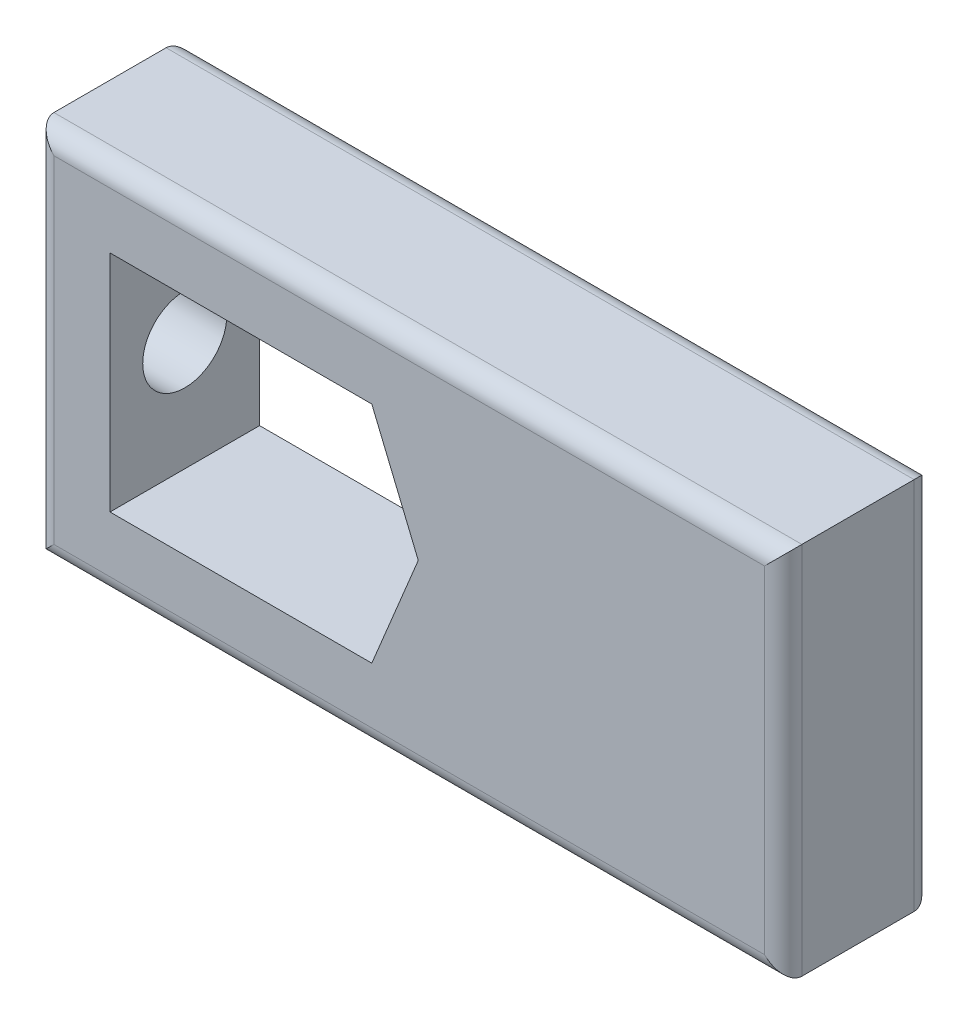
ISO-10303-21;
HEADER;
FILE_DESCRIPTION(('STEP AP214'),'2;1');
FILE_NAME('part.step','',(''),(''),'','','');
FILE_SCHEMA(('AUTOMOTIVE_DESIGN { 1 0 10303 214 1 1 1 1 }'));
ENDSEC;
DATA;
#1=APPLICATION_CONTEXT('core data for automotive mechanical design processes');
#2=APPLICATION_PROTOCOL_DEFINITION('international standard','automotive_design',2000,#1);
#3=PRODUCT_CONTEXT('',#1,'mechanical');
#4=PRODUCT('Part','Part','',(#3));
#5=PRODUCT_RELATED_PRODUCT_CATEGORY('part','',(#4));
#6=PRODUCT_DEFINITION_FORMATION('','',#4);
#7=PRODUCT_DEFINITION_CONTEXT('part definition',#1,'design');
#8=PRODUCT_DEFINITION('design','',#6,#7);
#9=PRODUCT_DEFINITION_SHAPE('','',#8);
#10=(LENGTH_UNIT() NAMED_UNIT(*) SI_UNIT(.MILLI.,.METRE.));
#11=(NAMED_UNIT(*) PLANE_ANGLE_UNIT() SI_UNIT($,.RADIAN.));
#12=(NAMED_UNIT(*) SI_UNIT($,.STERADIAN.) SOLID_ANGLE_UNIT());
#13=UNCERTAINTY_MEASURE_WITH_UNIT(LENGTH_MEASURE(1.E-05),#10,'distance_accuracy_value','');
#14=(GEOMETRIC_REPRESENTATION_CONTEXT(3) GLOBAL_UNCERTAINTY_ASSIGNED_CONTEXT((#13)) GLOBAL_UNIT_ASSIGNED_CONTEXT((#10,
#11,#12)) REPRESENTATION_CONTEXT('',''));
#15=CARTESIAN_POINT('',(0.,0.,0.));
#16=DIRECTION('',(0.,0.,1.));
#17=DIRECTION('',(1.,0.,0.));
#18=AXIS2_PLACEMENT_3D('',#15,#16,#17);
#19=CARTESIAN_POINT('',(0.,0.,8.));
#20=DIRECTION('',(0.,0.,-1.));
#21=DIRECTION('',(-1.,0.,0.));
#22=AXIS2_PLACEMENT_3D('',#19,#20,#21);
#23=PLANE('',#22);
#24=DIRECTION('',(1.,0.,0.));
#25=VECTOR('',#24,1.);
#26=CARTESIAN_POINT('',(0.,1.,8.));
#27=LINE('',#26,#25);
#28=CARTESIAN_POINT('',(1.,1.,8.));
#29=VERTEX_POINT('',#28);
#30=CARTESIAN_POINT('',(39.,1.,8.));
#31=VERTEX_POINT('',#30);
#32=EDGE_CURVE('E226',#29,#31,#27,.T.);
#33=ORIENTED_EDGE('',*,*,#32,.T.);
#34=DIRECTION('',(0.,1.,0.));
#35=VECTOR('',#34,1.);
#36=CARTESIAN_POINT('',(39.,0.,8.));
#37=LINE('',#36,#35);
#38=CARTESIAN_POINT('',(39.,19.,8.));
#39=VERTEX_POINT('',#38);
#40=EDGE_CURVE('E229',#31,#39,#37,.T.);
#41=ORIENTED_EDGE('',*,*,#40,.T.);
#42=DIRECTION('',(-1.,0.,0.));
#43=VECTOR('',#42,1.);
#44=CARTESIAN_POINT('',(0.,19.,8.));
#45=LINE('',#44,#43);
#46=CARTESIAN_POINT('',(1.,19.,8.));
#47=VERTEX_POINT('',#46);
#48=EDGE_CURVE('E216',#39,#47,#45,.T.);
#49=ORIENTED_EDGE('',*,*,#48,.T.);
#50=DIRECTION('',(0.,-1.,0.));
#51=VECTOR('',#50,1.);
#52=CARTESIAN_POINT('',(1.,0.,8.));
#53=LINE('',#52,#51);
#54=EDGE_CURVE('E223',#47,#29,#53,.T.);
#55=ORIENTED_EDGE('',*,*,#54,.T.);
#56=EDGE_LOOP('',(#33,#41,#49,#55));
#57=FACE_BOUND('',#56,.T.);
#58=DIRECTION('',(-1.,0.,0.));
#59=VECTOR('',#58,1.);
#60=CARTESIAN_POINT('',(18.,16.,8.));
#61=LINE('',#60,#59);
#62=CARTESIAN_POINT('',(18.,16.,8.));
#63=VERTEX_POINT('',#62);
#64=CARTESIAN_POINT('',(4.,16.,8.));
#65=VERTEX_POINT('',#64);
#66=EDGE_CURVE('E138',#63,#65,#61,.T.);
#67=ORIENTED_EDGE('',*,*,#66,.F.);
#68=DIRECTION('',(-0.382683432365091,0.923879532511287,0.));
#69=VECTOR('',#68,1.);
#70=CARTESIAN_POINT('',(20.4852813742386,10.,8.));
#71=LINE('',#70,#69);
#72=CARTESIAN_POINT('',(20.4852813742386,10.,8.));
#73=VERTEX_POINT('',#72);
#74=EDGE_CURVE('E174',#73,#63,#71,.T.);
#75=ORIENTED_EDGE('',*,*,#74,.F.);
#76=DIRECTION('',(0.382683432365091,0.923879532511287,0.));
#77=VECTOR('',#76,1.);
#78=CARTESIAN_POINT('',(18.,4.,8.));
#79=LINE('',#78,#77);
#80=CARTESIAN_POINT('',(18.,4.,8.));
#81=VERTEX_POINT('',#80);
#82=EDGE_CURVE('E167',#81,#73,#79,.T.);
#83=ORIENTED_EDGE('',*,*,#82,.F.);
#84=DIRECTION('',(1.,0.,0.));
#85=VECTOR('',#84,1.);
#86=CARTESIAN_POINT('',(4.,4.,8.));
#87=LINE('',#86,#85);
#88=CARTESIAN_POINT('',(4.,4.,8.));
#89=VERTEX_POINT('',#88);
#90=EDGE_CURVE('E163',#89,#81,#87,.T.);
#91=ORIENTED_EDGE('',*,*,#90,.F.);
#92=DIRECTION('',(0.,-1.,0.));
#93=VECTOR('',#92,1.);
#94=CARTESIAN_POINT('',(4.,16.,8.));
#95=LINE('',#94,#93);
#96=EDGE_CURVE('E149',#65,#89,#95,.T.);
#97=ORIENTED_EDGE('',*,*,#96,.F.);
#98=EDGE_LOOP('',(#67,#75,#83,#91,#97));
#99=FACE_BOUND('',#98,.T.);
#100=ADVANCED_FACE('F39',(#57,#99),#23,.F.);
#101=CARTESIAN_POINT('',(0.,0.,0.));
#102=DIRECTION('',(0.,0.,-1.));
#103=DIRECTION('',(-1.,0.,0.));
#104=AXIS2_PLACEMENT_3D('',#101,#102,#103);
#105=PLANE('',#104);
#106=DIRECTION('',(-1.,0.,0.));
#107=VECTOR('',#106,1.);
#108=CARTESIAN_POINT('',(40.,19.,0.));
#109=LINE('',#108,#107);
#110=CARTESIAN_POINT('',(1.,19.,0.));
#111=VERTEX_POINT('',#110);
#112=CARTESIAN_POINT('',(39.,19.,0.));
#113=VERTEX_POINT('',#112);
#114=EDGE_CURVE('E264',#111,#113,#109,.F.);
#115=ORIENTED_EDGE('',*,*,#114,.T.);
#116=DIRECTION('',(0.,1.,0.));
#117=VECTOR('',#116,1.);
#118=CARTESIAN_POINT('',(39.,0.,0.));
#119=LINE('',#118,#117);
#120=CARTESIAN_POINT('',(39.,1.,0.));
#121=VERTEX_POINT('',#120);
#122=EDGE_CURVE('E273',#113,#121,#119,.F.);
#123=ORIENTED_EDGE('',*,*,#122,.T.);
#124=DIRECTION('',(1.,0.,0.));
#125=VECTOR('',#124,1.);
#126=CARTESIAN_POINT('',(0.,1.,0.));
#127=LINE('',#126,#125);
#128=CARTESIAN_POINT('',(1.,1.,0.));
#129=VERTEX_POINT('',#128);
#130=EDGE_CURVE('E270',#121,#129,#127,.F.);
#131=ORIENTED_EDGE('',*,*,#130,.T.);
#132=DIRECTION('',(0.,-1.,0.));
#133=VECTOR('',#132,1.);
#134=CARTESIAN_POINT('',(1.,20.,0.));
#135=LINE('',#134,#133);
#136=EDGE_CURVE('E267',#129,#111,#135,.F.);
#137=ORIENTED_EDGE('',*,*,#136,.T.);
#138=EDGE_LOOP('',(#115,#123,#131,#137));
#139=FACE_BOUND('',#138,.T.);
#140=DIRECTION('',(-0.382683432365091,0.923879532511287,0.));
#141=VECTOR('',#140,1.);
#142=CARTESIAN_POINT('',(20.4852813742386,10.,0.));
#143=LINE('',#142,#141);
#144=CARTESIAN_POINT('',(20.4852813742386,10.,0.));
#145=VERTEX_POINT('',#144);
#146=CARTESIAN_POINT('',(18.,16.,0.));
#147=VERTEX_POINT('',#146);
#148=EDGE_CURVE('E150',#145,#147,#143,.T.);
#149=ORIENTED_EDGE('',*,*,#148,.T.);
#150=DIRECTION('',(-1.,0.,0.));
#151=VECTOR('',#150,1.);
#152=CARTESIAN_POINT('',(18.,16.,0.));
#153=LINE('',#152,#151);
#154=CARTESIAN_POINT('',(4.,16.,0.));
#155=VERTEX_POINT('',#154);
#156=EDGE_CURVE('E177',#147,#155,#153,.T.);
#157=ORIENTED_EDGE('',*,*,#156,.T.);
#158=DIRECTION('',(0.,-1.,0.));
#159=VECTOR('',#158,1.);
#160=CARTESIAN_POINT('',(4.,16.,0.));
#161=LINE('',#160,#159);
#162=CARTESIAN_POINT('',(4.,4.,0.));
#163=VERTEX_POINT('',#162);
#164=EDGE_CURVE('E156',#155,#163,#161,.T.);
#165=ORIENTED_EDGE('',*,*,#164,.T.);
#166=DIRECTION('',(1.,0.,0.));
#167=VECTOR('',#166,1.);
#168=CARTESIAN_POINT('',(4.,4.,0.));
#169=LINE('',#168,#167);
#170=CARTESIAN_POINT('',(18.,4.,0.));
#171=VERTEX_POINT('',#170);
#172=EDGE_CURVE('E183',#163,#171,#169,.T.);
#173=ORIENTED_EDGE('',*,*,#172,.T.);
#174=DIRECTION('',(0.382683432365091,0.923879532511287,0.));
#175=VECTOR('',#174,1.);
#176=CARTESIAN_POINT('',(18.,4.,0.));
#177=LINE('',#176,#175);
#178=EDGE_CURVE('E187',#171,#145,#177,.T.);
#179=ORIENTED_EDGE('',*,*,#178,.T.);
#180=EDGE_LOOP('',(#149,#157,#165,#173,#179));
#181=FACE_BOUND('',#180,.T.);
#182=ADVANCED_FACE('F304',(#139,#181),#105,.T.);
#183=CARTESIAN_POINT('',(40.,0.,8.));
#184=DIRECTION('',(0.,1.,0.));
#185=DIRECTION('',(0.,0.,1.));
#186=AXIS2_PLACEMENT_3D('',#183,#184,#185);
#187=PLANE('',#186);
#188=DIRECTION('',(0.,0.,-1.));
#189=VECTOR('',#188,1.);
#190=CARTESIAN_POINT('',(0.,0.,8.));
#191=LINE('',#190,#189);
#192=CARTESIAN_POINT('',(0.,0.,7.));
#193=VERTEX_POINT('',#192);
#194=CARTESIAN_POINT('',(0.,0.,1.));
#195=VERTEX_POINT('',#194);
#196=EDGE_CURVE('E158',#193,#195,#191,.T.);
#197=ORIENTED_EDGE('',*,*,#196,.T.);
#198=DIRECTION('',(1.,0.,0.));
#199=VECTOR('',#198,1.);
#200=CARTESIAN_POINT('',(40.,0.,1.));
#201=LINE('',#200,#199);
#202=CARTESIAN_POINT('',(40.,0.,1.));
#203=VERTEX_POINT('',#202);
#204=EDGE_CURVE('E277',#195,#203,#201,.T.);
#205=ORIENTED_EDGE('',*,*,#204,.T.);
#206=DIRECTION('',(0.,0.,-1.));
#207=VECTOR('',#206,1.);
#208=CARTESIAN_POINT('',(40.,0.,8.));
#209=LINE('',#208,#207);
#210=CARTESIAN_POINT('',(40.,0.,7.));
#211=VERTEX_POINT('',#210);
#212=EDGE_CURVE('E212',#211,#203,#209,.T.);
#213=ORIENTED_EDGE('',*,*,#212,.F.);
#214=DIRECTION('',(1.,0.,0.));
#215=VECTOR('',#214,1.);
#216=CARTESIAN_POINT('',(40.,0.,7.));
#217=LINE('',#216,#215);
#218=EDGE_CURVE('E237',#211,#193,#217,.F.);
#219=ORIENTED_EDGE('',*,*,#218,.T.);
#220=EDGE_LOOP('',(#197,#205,#213,#219));
#221=FACE_BOUND('',#220,.T.);
#222=ADVANCED_FACE('F330',(#221),#187,.F.);
#223=CARTESIAN_POINT('',(40.,20.,8.));
#224=DIRECTION('',(-1.,0.,0.));
#225=DIRECTION('',(0.,0.,1.));
#226=AXIS2_PLACEMENT_3D('',#223,#224,#225);
#227=PLANE('',#226);
#228=ORIENTED_EDGE('',*,*,#212,.T.);
#229=DIRECTION('',(0.,1.,0.));
#230=VECTOR('',#229,1.);
#231=CARTESIAN_POINT('',(40.,20.,1.));
#232=LINE('',#231,#230);
#233=CARTESIAN_POINT('',(40.,20.,1.));
#234=VERTEX_POINT('',#233);
#235=EDGE_CURVE('E246',#203,#234,#232,.T.);
#236=ORIENTED_EDGE('',*,*,#235,.T.);
#237=DIRECTION('',(0.,0.,-1.));
#238=VECTOR('',#237,1.);
#239=CARTESIAN_POINT('',(40.,20.,8.));
#240=LINE('',#239,#238);
#241=CARTESIAN_POINT('',(40.,20.,7.));
#242=VERTEX_POINT('',#241);
#243=EDGE_CURVE('E209',#242,#234,#240,.T.);
#244=ORIENTED_EDGE('',*,*,#243,.F.);
#245=DIRECTION('',(0.,1.,0.));
#246=VECTOR('',#245,1.);
#247=CARTESIAN_POINT('',(40.,20.,7.));
#248=LINE('',#247,#246);
#249=EDGE_CURVE('E233',#242,#211,#248,.F.);
#250=ORIENTED_EDGE('',*,*,#249,.T.);
#251=EDGE_LOOP('',(#228,#236,#244,#250));
#252=FACE_BOUND('',#251,.T.);
#253=ADVANCED_FACE('F314',(#252),#227,.F.);
#254=CARTESIAN_POINT('',(0.,20.,8.));
#255=DIRECTION('',(0.,-1.,0.));
#256=DIRECTION('',(0.,0.,-1.));
#257=AXIS2_PLACEMENT_3D('',#254,#255,#256);
#258=PLANE('',#257);
#259=ORIENTED_EDGE('',*,*,#243,.T.);
#260=DIRECTION('',(-1.,0.,0.));
#261=VECTOR('',#260,1.);
#262=CARTESIAN_POINT('',(0.,20.,1.));
#263=LINE('',#262,#261);
#264=CARTESIAN_POINT('',(0.,20.,1.));
#265=VERTEX_POINT('',#264);
#266=EDGE_CURVE('E11',#234,#265,#263,.T.);
#267=ORIENTED_EDGE('',*,*,#266,.T.);
#268=DIRECTION('',(0.,0.,-1.));
#269=VECTOR('',#268,1.);
#270=CARTESIAN_POINT('',(0.,20.,8.));
#271=LINE('',#270,#269);
#272=CARTESIAN_POINT('',(0.,20.,7.));
#273=VERTEX_POINT('',#272);
#274=EDGE_CURVE('E206',#273,#265,#271,.T.);
#275=ORIENTED_EDGE('',*,*,#274,.F.);
#276=DIRECTION('',(-1.,0.,0.));
#277=VECTOR('',#276,1.);
#278=CARTESIAN_POINT('',(0.,20.,7.));
#279=LINE('',#278,#277);
#280=EDGE_CURVE('E243',#273,#242,#279,.F.);
#281=ORIENTED_EDGE('',*,*,#280,.T.);
#282=EDGE_LOOP('',(#259,#267,#275,#281));
#283=FACE_BOUND('',#282,.T.);
#284=ADVANCED_FACE('F317',(#283),#258,.F.);
#285=CARTESIAN_POINT('',(0.,0.,8.));
#286=DIRECTION('',(1.,0.,0.));
#287=DIRECTION('',(0.,0.,-1.));
#288=AXIS2_PLACEMENT_3D('',#285,#286,#287);
#289=PLANE('',#288);
#290=CARTESIAN_POINT('',(0.,10.,4.));
#291=DIRECTION('',(-1.,0.,0.));
#292=DIRECTION('',(0.,0.,1.));
#293=AXIS2_PLACEMENT_3D('',#290,#291,#292);
#294=CIRCLE('',#293,2.25);
#295=CARTESIAN_POINT('',(0.,10.,6.25));
#296=VERTEX_POINT('',#295);
#297=EDGE_CURVE('E220',#296,#296,#294,.T.);
#298=ORIENTED_EDGE('',*,*,#297,.F.);
#299=EDGE_LOOP('',(#298));
#300=FACE_BOUND('',#299,.T.);
#301=ORIENTED_EDGE('',*,*,#274,.T.);
#302=DIRECTION('',(0.,-1.,0.));
#303=VECTOR('',#302,1.);
#304=CARTESIAN_POINT('',(0.,0.,1.));
#305=LINE('',#304,#303);
#306=EDGE_CURVE('E49',#265,#195,#305,.T.);
#307=ORIENTED_EDGE('',*,*,#306,.T.);
#308=ORIENTED_EDGE('',*,*,#196,.F.);
#309=DIRECTION('',(0.,-1.,0.));
#310=VECTOR('',#309,1.);
#311=CARTESIAN_POINT('',(0.,0.,7.));
#312=LINE('',#311,#310);
#313=EDGE_CURVE('E240',#193,#273,#312,.F.);
#314=ORIENTED_EDGE('',*,*,#313,.T.);
#315=EDGE_LOOP('',(#301,#307,#308,#314));
#316=FACE_BOUND('',#315,.T.);
#317=ADVANCED_FACE('F332',(#300,#316),#289,.F.);
#318=CARTESIAN_POINT('',(18.,16.,8.));
#319=DIRECTION('',(0.,-1.,0.));
#320=DIRECTION('',(1.,0.,0.));
#321=AXIS2_PLACEMENT_3D('',#318,#319,#320);
#322=PLANE('',#321);
#323=ORIENTED_EDGE('',*,*,#156,.F.);
#324=DIRECTION('',(0.,0.,-1.));
#325=VECTOR('',#324,1.);
#326=CARTESIAN_POINT('',(18.,16.,8.));
#327=LINE('',#326,#325);
#328=EDGE_CURVE('E144',#63,#147,#327,.T.);
#329=ORIENTED_EDGE('',*,*,#328,.F.);
#330=ORIENTED_EDGE('',*,*,#66,.T.);
#331=DIRECTION('',(0.,0.,-1.));
#332=VECTOR('',#331,1.);
#333=CARTESIAN_POINT('',(4.,16.,8.));
#334=LINE('',#333,#332);
#335=EDGE_CURVE('E141',#65,#155,#334,.T.);
#336=ORIENTED_EDGE('',*,*,#335,.T.);
#337=EDGE_LOOP('',(#323,#329,#330,#336));
#338=FACE_BOUND('',#337,.T.);
#339=ADVANCED_FACE('F140',(#338),#322,.T.);
#340=CARTESIAN_POINT('',(4.,16.,8.));
#341=DIRECTION('',(1.,0.,0.));
#342=DIRECTION('',(0.,0.,-1.));
#343=AXIS2_PLACEMENT_3D('',#340,#341,#342);
#344=PLANE('',#343);
#345=CARTESIAN_POINT('',(4.,10.,4.));
#346=DIRECTION('',(1.,0.,0.));
#347=DIRECTION('',(0.,0.,-1.));
#348=AXIS2_PLACEMENT_3D('',#345,#346,#347);
#349=CIRCLE('',#348,2.25);
#350=CARTESIAN_POINT('',(4.,10.,1.75));
#351=VERTEX_POINT('',#350);
#352=EDGE_CURVE('E180',#351,#351,#349,.T.);
#353=ORIENTED_EDGE('',*,*,#352,.F.);
#354=EDGE_LOOP('',(#353));
#355=FACE_BOUND('',#354,.T.);
#356=ORIENTED_EDGE('',*,*,#164,.F.);
#357=ORIENTED_EDGE('',*,*,#335,.F.);
#358=ORIENTED_EDGE('',*,*,#96,.T.);
#359=DIRECTION('',(0.,0.,-1.));
#360=VECTOR('',#359,1.);
#361=CARTESIAN_POINT('',(4.,4.,8.));
#362=LINE('',#361,#360);
#363=EDGE_CURVE('E159',#89,#163,#362,.T.);
#364=ORIENTED_EDGE('',*,*,#363,.T.);
#365=EDGE_LOOP('',(#356,#357,#358,#364));
#366=FACE_BOUND('',#365,.T.);
#367=ADVANCED_FACE('F153',(#355,#366),#344,.T.);
#368=CARTESIAN_POINT('',(4.,4.,8.));
#369=DIRECTION('',(0.,1.,0.));
#370=DIRECTION('',(0.,0.,1.));
#371=AXIS2_PLACEMENT_3D('',#368,#369,#370);
#372=PLANE('',#371);
#373=ORIENTED_EDGE('',*,*,#172,.F.);
#374=ORIENTED_EDGE('',*,*,#363,.F.);
#375=ORIENTED_EDGE('',*,*,#90,.T.);
#376=DIRECTION('',(0.,0.,-1.));
#377=VECTOR('',#376,1.);
#378=CARTESIAN_POINT('',(18.,4.,8.));
#379=LINE('',#378,#377);
#380=EDGE_CURVE('E199',#81,#171,#379,.T.);
#381=ORIENTED_EDGE('',*,*,#380,.T.);
#382=EDGE_LOOP('',(#373,#374,#375,#381));
#383=FACE_BOUND('',#382,.T.);
#384=ADVANCED_FACE('F418',(#383),#372,.T.);
#385=CARTESIAN_POINT('',(18.,4.,8.));
#386=DIRECTION('',(-0.923879532511286,0.382683432365091,0.));
#387=DIRECTION('',(-0.382683432365091,-0.923879532511286,0.));
#388=AXIS2_PLACEMENT_3D('',#385,#386,#387);
#389=PLANE('',#388);
#390=ORIENTED_EDGE('',*,*,#178,.F.);
#391=ORIENTED_EDGE('',*,*,#380,.F.);
#392=ORIENTED_EDGE('',*,*,#82,.T.);
#393=DIRECTION('',(0.,0.,-1.));
#394=VECTOR('',#393,1.);
#395=CARTESIAN_POINT('',(20.4852813742386,10.,8.));
#396=LINE('',#395,#394);
#397=EDGE_CURVE('E196',#73,#145,#396,.T.);
#398=ORIENTED_EDGE('',*,*,#397,.T.);
#399=EDGE_LOOP('',(#390,#391,#392,#398));
#400=FACE_BOUND('',#399,.T.);
#401=ADVANCED_FACE('F410',(#400),#389,.T.);
#402=CARTESIAN_POINT('',(20.4852813742386,10.,8.));
#403=DIRECTION('',(-0.923879532511287,-0.382683432365091,0.));
#404=DIRECTION('',(0.382683432365091,-0.923879532511287,0.));
#405=AXIS2_PLACEMENT_3D('',#402,#403,#404);
#406=PLANE('',#405);
#407=ORIENTED_EDGE('',*,*,#148,.F.);
#408=ORIENTED_EDGE('',*,*,#397,.F.);
#409=ORIENTED_EDGE('',*,*,#74,.T.);
#410=ORIENTED_EDGE('',*,*,#328,.T.);
#411=EDGE_LOOP('',(#407,#408,#409,#410));
#412=FACE_BOUND('',#411,.T.);
#413=ADVANCED_FACE('F401',(#412),#406,.T.);
#414=CARTESIAN_POINT('',(8.,10.,4.));
#415=DIRECTION('',(-1.,0.,0.));
#416=DIRECTION('',(0.,0.,1.));
#417=AXIS2_PLACEMENT_3D('',#414,#415,#416);
#418=CYLINDRICAL_SURFACE('',#417,2.25);
#419=ORIENTED_EDGE('',*,*,#352,.T.);
#420=EDGE_LOOP('',(#419));
#421=FACE_BOUND('',#420,.T.);
#422=ORIENTED_EDGE('',*,*,#297,.T.);
#423=EDGE_LOOP('',(#422));
#424=FACE_BOUND('',#423,.T.);
#425=ADVANCED_FACE('F367',(#421,#424),#418,.F.);
#426=CARTESIAN_POINT('',(1.,0.,7.));
#427=DIRECTION('',(0.,-1.,0.));
#428=DIRECTION('',(0.,0.,-1.));
#429=AXIS2_PLACEMENT_3D('',#426,#427,#428);
#430=CYLINDRICAL_SURFACE('',#429,1.);
#431=CARTESIAN_POINT('',(1.,19.,7.));
#432=DIRECTION('',(-0.707106781186547,-0.707106781186547,0.));
#433=DIRECTION('',(-0.707106781186547,0.707106781186547,0.));
#434=AXIS2_PLACEMENT_3D('',#431,#432,#433);
#435=ELLIPSE('',#434,1.41421356237309,1.);
#436=EDGE_CURVE('E253',#273,#47,#435,.F.);
#437=ORIENTED_EDGE('',*,*,#436,.F.);
#438=ORIENTED_EDGE('',*,*,#313,.F.);
#439=CARTESIAN_POINT('',(1.,1.,7.));
#440=DIRECTION('',(0.707106781186547,-0.707106781186547,0.));
#441=DIRECTION('',(-0.707106781186547,-0.707106781186547,0.));
#442=AXIS2_PLACEMENT_3D('',#439,#440,#441);
#443=ELLIPSE('',#442,1.41421356237309,1.);
#444=EDGE_CURVE('E257',#29,#193,#443,.T.);
#445=ORIENTED_EDGE('',*,*,#444,.F.);
#446=ORIENTED_EDGE('',*,*,#54,.F.);
#447=EDGE_LOOP('',(#437,#438,#445,#446));
#448=FACE_BOUND('',#447,.T.);
#449=ADVANCED_FACE('F335',(#448),#430,.T.);
#450=CARTESIAN_POINT('',(0.,1.,7.));
#451=DIRECTION('',(1.,0.,0.));
#452=DIRECTION('',(0.,0.,-1.));
#453=AXIS2_PLACEMENT_3D('',#450,#451,#452);
#454=CYLINDRICAL_SURFACE('',#453,1.);
#455=ORIENTED_EDGE('',*,*,#444,.T.);
#456=ORIENTED_EDGE('',*,*,#218,.F.);
#457=CARTESIAN_POINT('',(39.,1.,7.));
#458=DIRECTION('',(0.707106781186547,0.707106781186547,0.));
#459=DIRECTION('',(0.707106781186547,-0.707106781186547,0.));
#460=AXIS2_PLACEMENT_3D('',#457,#458,#459);
#461=ELLIPSE('',#460,1.41421356237309,1.);
#462=EDGE_CURVE('E250',#31,#211,#461,.T.);
#463=ORIENTED_EDGE('',*,*,#462,.F.);
#464=ORIENTED_EDGE('',*,*,#32,.F.);
#465=EDGE_LOOP('',(#455,#456,#463,#464));
#466=FACE_BOUND('',#465,.T.);
#467=ADVANCED_FACE('F339',(#466),#454,.T.);
#468=CARTESIAN_POINT('',(0.,19.,7.));
#469=DIRECTION('',(-1.,0.,0.));
#470=DIRECTION('',(0.,0.,1.));
#471=AXIS2_PLACEMENT_3D('',#468,#469,#470);
#472=CYLINDRICAL_SURFACE('',#471,1.);
#473=ORIENTED_EDGE('',*,*,#436,.T.);
#474=ORIENTED_EDGE('',*,*,#48,.F.);
#475=CARTESIAN_POINT('',(39.,19.,7.));
#476=DIRECTION('',(-0.707106781186547,0.707106781186547,0.));
#477=DIRECTION('',(-0.707106781186547,-0.707106781186547,0.));
#478=AXIS2_PLACEMENT_3D('',#475,#476,#477);
#479=ELLIPSE('',#478,1.41421356237309,1.);
#480=EDGE_CURVE('E247',#242,#39,#479,.F.);
#481=ORIENTED_EDGE('',*,*,#480,.F.);
#482=ORIENTED_EDGE('',*,*,#280,.F.);
#483=EDGE_LOOP('',(#473,#474,#481,#482));
#484=FACE_BOUND('',#483,.T.);
#485=ADVANCED_FACE('F322',(#484),#472,.T.);
#486=CARTESIAN_POINT('',(39.,0.,7.));
#487=DIRECTION('',(0.,1.,0.));
#488=DIRECTION('',(0.,0.,1.));
#489=AXIS2_PLACEMENT_3D('',#486,#487,#488);
#490=CYLINDRICAL_SURFACE('',#489,1.);
#491=ORIENTED_EDGE('',*,*,#462,.T.);
#492=ORIENTED_EDGE('',*,*,#249,.F.);
#493=ORIENTED_EDGE('',*,*,#480,.T.);
#494=ORIENTED_EDGE('',*,*,#40,.F.);
#495=EDGE_LOOP('',(#491,#492,#493,#494));
#496=FACE_BOUND('',#495,.T.);
#497=ADVANCED_FACE('F326',(#496),#490,.T.);
#498=CARTESIAN_POINT('',(1.,0.,1.));
#499=DIRECTION('',(0.,1.,0.));
#500=DIRECTION('',(0.,0.,1.));
#501=AXIS2_PLACEMENT_3D('',#498,#499,#500);
#502=CYLINDRICAL_SURFACE('',#501,1.);
#503=CARTESIAN_POINT('',(1.,19.,1.));
#504=DIRECTION('',(0.707106781186547,0.707106781186547,0.));
#505=DIRECTION('',(0.707106781186547,-0.707106781186547,0.));
#506=AXIS2_PLACEMENT_3D('',#503,#504,#505);
#507=ELLIPSE('',#506,1.41421356237309,1.);
#508=EDGE_CURVE('E287',#111,#265,#507,.T.);
#509=ORIENTED_EDGE('',*,*,#508,.F.);
#510=ORIENTED_EDGE('',*,*,#136,.F.);
#511=CARTESIAN_POINT('',(1.,1.,1.));
#512=DIRECTION('',(-0.707106781186547,0.707106781186547,0.));
#513=DIRECTION('',(0.707106781186547,0.707106781186547,0.));
#514=AXIS2_PLACEMENT_3D('',#511,#512,#513);
#515=ELLIPSE('',#514,1.41421356237309,1.);
#516=EDGE_CURVE('E43',#195,#129,#515,.F.);
#517=ORIENTED_EDGE('',*,*,#516,.F.);
#518=ORIENTED_EDGE('',*,*,#306,.F.);
#519=EDGE_LOOP('',(#509,#510,#517,#518));
#520=FACE_BOUND('',#519,.T.);
#521=ADVANCED_FACE('F41',(#520),#502,.T.);
#522=CARTESIAN_POINT('',(40.,1.,1.));
#523=DIRECTION('',(-1.,0.,0.));
#524=DIRECTION('',(0.,0.,1.));
#525=AXIS2_PLACEMENT_3D('',#522,#523,#524);
#526=CYLINDRICAL_SURFACE('',#525,1.);
#527=ORIENTED_EDGE('',*,*,#516,.T.);
#528=ORIENTED_EDGE('',*,*,#130,.F.);
#529=CARTESIAN_POINT('',(39.,1.,1.));
#530=DIRECTION('',(-0.707106781186547,-0.707106781186547,0.));
#531=DIRECTION('',(-0.707106781186547,0.707106781186547,0.));
#532=AXIS2_PLACEMENT_3D('',#529,#530,#531);
#533=ELLIPSE('',#532,1.41421356237309,1.);
#534=EDGE_CURVE('E285',#203,#121,#533,.F.);
#535=ORIENTED_EDGE('',*,*,#534,.F.);
#536=ORIENTED_EDGE('',*,*,#204,.F.);
#537=EDGE_LOOP('',(#527,#528,#535,#536));
#538=FACE_BOUND('',#537,.T.);
#539=ADVANCED_FACE('F299',(#538),#526,.T.);
#540=CARTESIAN_POINT('',(0.,19.,1.));
#541=DIRECTION('',(1.,0.,0.));
#542=DIRECTION('',(0.,0.,-1.));
#543=AXIS2_PLACEMENT_3D('',#540,#541,#542);
#544=CYLINDRICAL_SURFACE('',#543,1.);
#545=ORIENTED_EDGE('',*,*,#508,.T.);
#546=ORIENTED_EDGE('',*,*,#266,.F.);
#547=CARTESIAN_POINT('',(39.,19.,1.));
#548=DIRECTION('',(0.707106781186547,-0.707106781186547,0.));
#549=DIRECTION('',(0.707106781186547,0.707106781186547,0.));
#550=AXIS2_PLACEMENT_3D('',#547,#548,#549);
#551=ELLIPSE('',#550,1.41421356237309,1.);
#552=EDGE_CURVE('E282',#113,#234,#551,.T.);
#553=ORIENTED_EDGE('',*,*,#552,.F.);
#554=ORIENTED_EDGE('',*,*,#114,.F.);
#555=EDGE_LOOP('',(#545,#546,#553,#554));
#556=FACE_BOUND('',#555,.T.);
#557=ADVANCED_FACE('F311',(#556),#544,.T.);
#558=CARTESIAN_POINT('',(39.,20.,1.));
#559=DIRECTION('',(0.,-1.,0.));
#560=DIRECTION('',(0.,0.,-1.));
#561=AXIS2_PLACEMENT_3D('',#558,#559,#560);
#562=CYLINDRICAL_SURFACE('',#561,1.);
#563=ORIENTED_EDGE('',*,*,#534,.T.);
#564=ORIENTED_EDGE('',*,*,#122,.F.);
#565=ORIENTED_EDGE('',*,*,#552,.T.);
#566=ORIENTED_EDGE('',*,*,#235,.F.);
#567=EDGE_LOOP('',(#563,#564,#565,#566));
#568=FACE_BOUND('',#567,.T.);
#569=ADVANCED_FACE('F309',(#568),#562,.T.);
#570=CLOSED_SHELL('',(#100,#182,#222,#253,#284,#317,#339,#367,#384,#401,#413,#425,#449,#467,
#485,#497,#521,#539,#557,#569));
#571=MANIFOLD_SOLID_BREP('B2',#570);
#572=ADVANCED_BREP_SHAPE_REPRESENTATION('',(#18,#571),#14);
#573=SHAPE_DEFINITION_REPRESENTATION(#9,#572);
ENDSEC;
END-ISO-10303-21;
